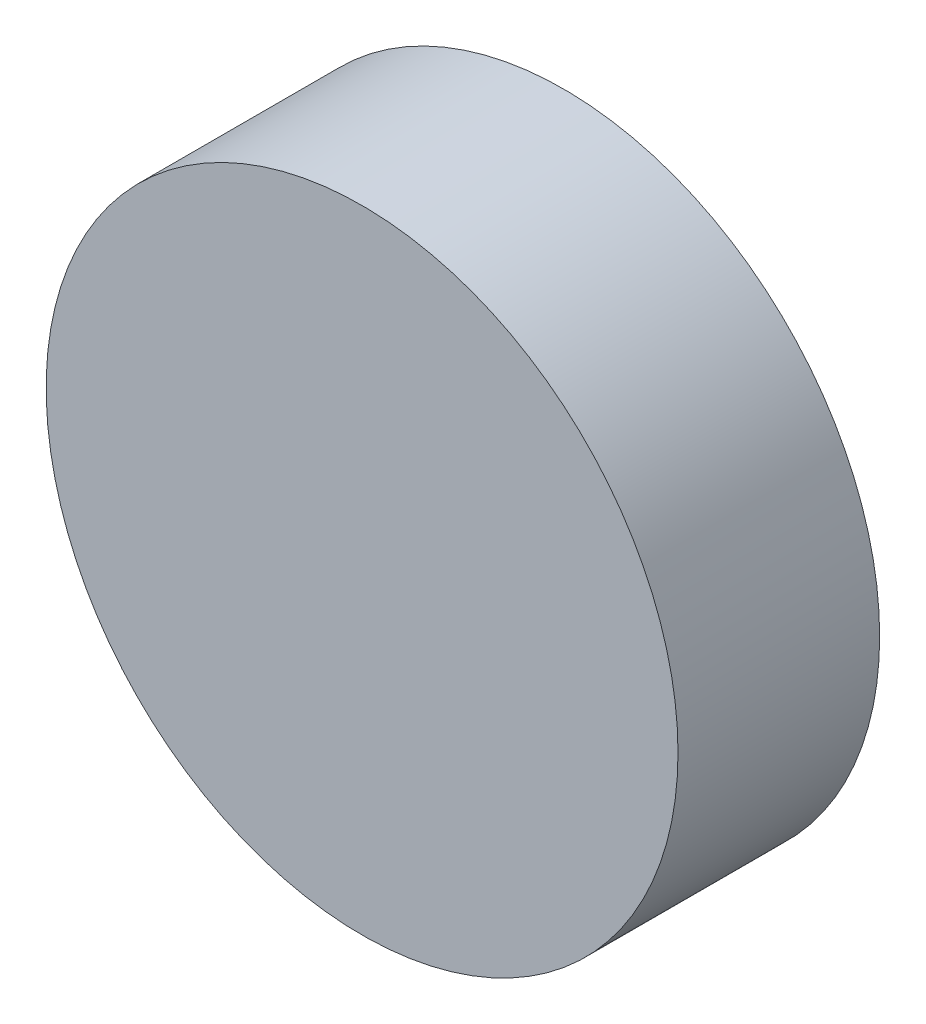
ISO-10303-21;
HEADER;
FILE_DESCRIPTION(('STEP AP214'),'2;1');
FILE_NAME('part.step','',(''),(''),'','','');
FILE_SCHEMA(('AUTOMOTIVE_DESIGN { 1 0 10303 214 1 1 1 1 }'));
ENDSEC;
DATA;
#1=APPLICATION_CONTEXT('core data for automotive mechanical design processes');
#2=APPLICATION_PROTOCOL_DEFINITION('international standard','automotive_design',2000,#1);
#3=PRODUCT_CONTEXT('',#1,'mechanical');
#4=PRODUCT('Part','Part','',(#3));
#5=PRODUCT_RELATED_PRODUCT_CATEGORY('part','',(#4));
#6=PRODUCT_DEFINITION_FORMATION('','',#4);
#7=PRODUCT_DEFINITION_CONTEXT('part definition',#1,'design');
#8=PRODUCT_DEFINITION('design','',#6,#7);
#9=PRODUCT_DEFINITION_SHAPE('','',#8);
#10=(LENGTH_UNIT() NAMED_UNIT(*) SI_UNIT(.MILLI.,.METRE.));
#11=(NAMED_UNIT(*) PLANE_ANGLE_UNIT() SI_UNIT($,.RADIAN.));
#12=(NAMED_UNIT(*) SI_UNIT($,.STERADIAN.) SOLID_ANGLE_UNIT());
#13=UNCERTAINTY_MEASURE_WITH_UNIT(LENGTH_MEASURE(1.E-05),#10,'distance_accuracy_value','');
#14=(GEOMETRIC_REPRESENTATION_CONTEXT(3) GLOBAL_UNCERTAINTY_ASSIGNED_CONTEXT((#13)) GLOBAL_UNIT_ASSIGNED_CONTEXT((#10,
#11,#12)) REPRESENTATION_CONTEXT('',''));
#15=CARTESIAN_POINT('',(0.,0.,0.));
#16=DIRECTION('',(0.,0.,1.));
#17=DIRECTION('',(1.,0.,0.));
#18=AXIS2_PLACEMENT_3D('',#15,#16,#17);
#19=CARTESIAN_POINT('',(0.,0.,15.));
#20=DIRECTION('',(0.,0.,-1.));
#21=DIRECTION('',(-1.,0.,0.));
#22=AXIS2_PLACEMENT_3D('',#19,#20,#21);
#23=CYLINDRICAL_SURFACE('',#22,47.);
#24=CARTESIAN_POINT('',(0.,0.,15.));
#25=DIRECTION('',(0.,0.,1.));
#26=DIRECTION('',(1.,0.,0.));
#27=AXIS2_PLACEMENT_3D('',#24,#25,#26);
#28=CIRCLE('',#27,47.);
#29=CARTESIAN_POINT('',(47.,0.,15.));
#30=VERTEX_POINT('',#29);
#31=EDGE_CURVE('E10',#30,#30,#28,.T.);
#32=ORIENTED_EDGE('',*,*,#31,.F.);
#33=EDGE_LOOP('',(#32));
#34=FACE_BOUND('',#33,.T.);
#35=CARTESIAN_POINT('',(0.,0.,-15.));
#36=DIRECTION('',(0.,0.,1.));
#37=DIRECTION('',(1.,0.,0.));
#38=AXIS2_PLACEMENT_3D('',#35,#36,#37);
#39=CIRCLE('',#38,47.);
#40=CARTESIAN_POINT('',(47.,0.,-15.));
#41=VERTEX_POINT('',#40);
#42=EDGE_CURVE('E44',#41,#41,#39,.T.);
#43=ORIENTED_EDGE('',*,*,#42,.T.);
#44=EDGE_LOOP('',(#43));
#45=FACE_BOUND('',#44,.T.);
#46=ADVANCED_FACE('F45',(#34,#45),#23,.T.);
#47=CARTESIAN_POINT('',(0.,0.,15.));
#48=DIRECTION('',(0.,0.,1.));
#49=DIRECTION('',(1.,0.,0.));
#50=AXIS2_PLACEMENT_3D('',#47,#48,#49);
#51=PLANE('',#50);
#52=ORIENTED_EDGE('',*,*,#31,.T.);
#53=EDGE_LOOP('',(#52));
#54=FACE_BOUND('',#53,.T.);
#55=ADVANCED_FACE('F56',(#54),#51,.T.);
#56=CARTESIAN_POINT('',(0.,0.,-15.));
#57=DIRECTION('',(0.,0.,1.));
#58=DIRECTION('',(1.,0.,0.));
#59=AXIS2_PLACEMENT_3D('',#56,#57,#58);
#60=PLANE('',#59);
#61=ORIENTED_EDGE('',*,*,#42,.F.);
#62=EDGE_LOOP('',(#61));
#63=FACE_BOUND('',#62,.T.);
#64=ADVANCED_FACE('F60',(#63),#60,.F.);
#65=CLOSED_SHELL('',(#46,#55,#64));
#66=MANIFOLD_SOLID_BREP('B2',#65);
#67=ADVANCED_BREP_SHAPE_REPRESENTATION('',(#18,#66),#14);
#68=SHAPE_DEFINITION_REPRESENTATION(#9,#67);
ENDSEC;
END-ISO-10303-21;
